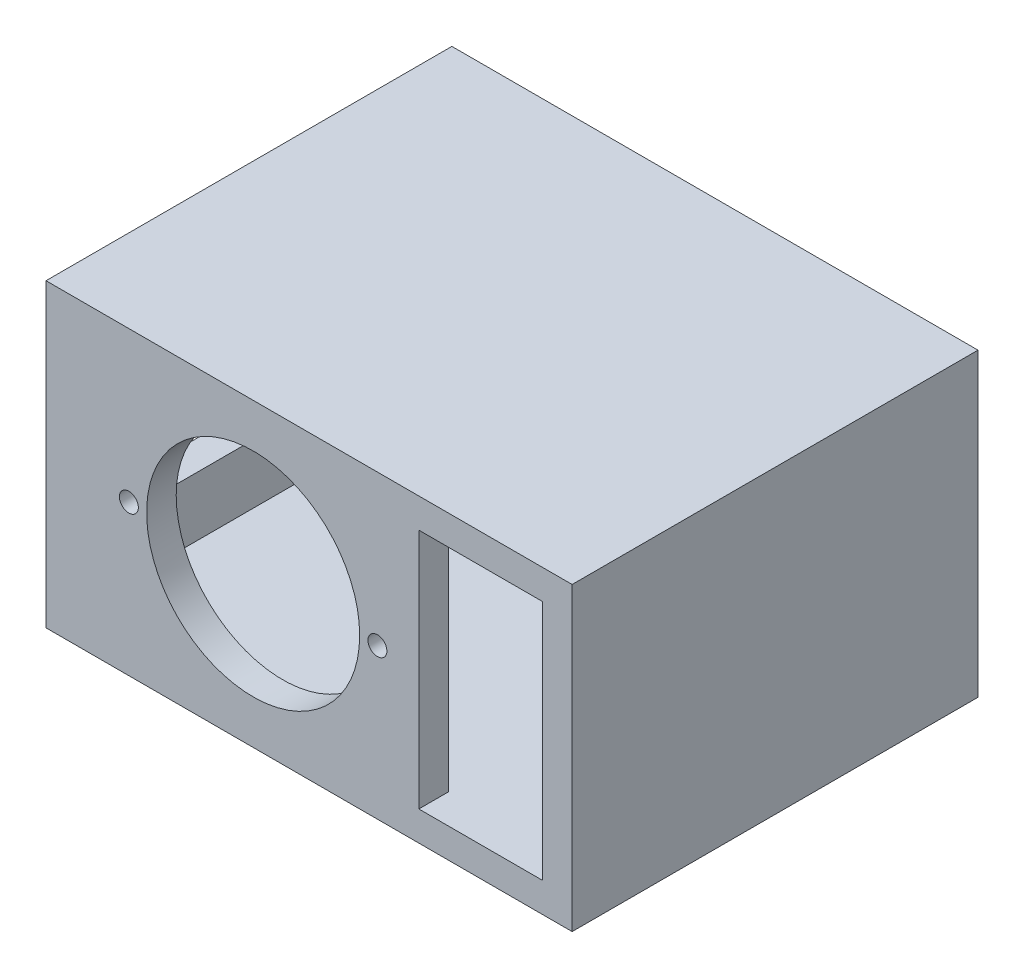
ISO-10303-21;
HEADER;
FILE_DESCRIPTION(('STEP AP214'),'2;1');
FILE_NAME('part.step','',(''),(''),'','','');
FILE_SCHEMA(('AUTOMOTIVE_DESIGN { 1 0 10303 214 1 1 1 1 }'));
ENDSEC;
DATA;
#1=APPLICATION_CONTEXT('core data for automotive mechanical design processes');
#2=APPLICATION_PROTOCOL_DEFINITION('international standard','automotive_design',2000,#1);
#3=PRODUCT_CONTEXT('',#1,'mechanical');
#4=PRODUCT('Part','Part','',(#3));
#5=PRODUCT_RELATED_PRODUCT_CATEGORY('part','',(#4));
#6=PRODUCT_DEFINITION_FORMATION('','',#4);
#7=PRODUCT_DEFINITION_CONTEXT('part definition',#1,'design');
#8=PRODUCT_DEFINITION('design','',#6,#7);
#9=PRODUCT_DEFINITION_SHAPE('','',#8);
#10=(LENGTH_UNIT() NAMED_UNIT(*) SI_UNIT(.MILLI.,.METRE.));
#11=(NAMED_UNIT(*) PLANE_ANGLE_UNIT() SI_UNIT($,.RADIAN.));
#12=(NAMED_UNIT(*) SI_UNIT($,.STERADIAN.) SOLID_ANGLE_UNIT());
#13=UNCERTAINTY_MEASURE_WITH_UNIT(LENGTH_MEASURE(1.E-05),#10,'distance_accuracy_value','');
#14=(GEOMETRIC_REPRESENTATION_CONTEXT(3) GLOBAL_UNCERTAINTY_ASSIGNED_CONTEXT((#13)) GLOBAL_UNIT_ASSIGNED_CONTEXT((#10,
#11,#12)) REPRESENTATION_CONTEXT('',''));
#15=CARTESIAN_POINT('',(0.,0.,0.));
#16=DIRECTION('',(0.,0.,1.));
#17=DIRECTION('',(1.,0.,0.));
#18=AXIS2_PLACEMENT_3D('',#15,#16,#17);
#19=CARTESIAN_POINT('',(5.,0.,68.58));
#20=DIRECTION('',(1.,0.,0.));
#21=DIRECTION('',(0.,0.,-1.));
#22=AXIS2_PLACEMENT_3D('',#19,#20,#21);
#23=PLANE('',#22);
#24=DIRECTION('',(0.,1.,0.));
#25=VECTOR('',#24,1.);
#26=CARTESIAN_POINT('',(5.,0.,15.));
#27=LINE('',#26,#25);
#28=CARTESIAN_POINT('',(5.,15.,15.));
#29=VERTEX_POINT('',#28);
#30=CARTESIAN_POINT('',(5.,35.8,15.));
#31=VERTEX_POINT('',#30);
#32=EDGE_CURVE('E179',#29,#31,#27,.T.);
#33=ORIENTED_EDGE('',*,*,#32,.F.);
#34=DIRECTION('',(0.,0.,-1.));
#35=VECTOR('',#34,1.);
#36=CARTESIAN_POINT('',(5.,15.,68.58));
#37=LINE('',#36,#35);
#38=CARTESIAN_POINT('',(5.,15.,53.58));
#39=VERTEX_POINT('',#38);
#40=EDGE_CURVE('E172',#39,#29,#37,.T.);
#41=ORIENTED_EDGE('',*,*,#40,.F.);
#42=DIRECTION('',(0.,-1.,0.));
#43=VECTOR('',#42,1.);
#44=CARTESIAN_POINT('',(5.,0.,53.58));
#45=LINE('',#44,#43);
#46=CARTESIAN_POINT('',(5.,35.8,53.58));
#47=VERTEX_POINT('',#46);
#48=EDGE_CURVE('E152',#47,#39,#45,.T.);
#49=ORIENTED_EDGE('',*,*,#48,.F.);
#50=DIRECTION('',(0.,0.,1.));
#51=VECTOR('',#50,1.);
#52=CARTESIAN_POINT('',(5.,35.8,68.58));
#53=LINE('',#52,#51);
#54=EDGE_CURVE('E177',#31,#47,#53,.T.);
#55=ORIENTED_EDGE('',*,*,#54,.F.);
#56=EDGE_LOOP('',(#33,#41,#49,#55));
#57=FACE_BOUND('',#56,.T.);
#58=DIRECTION('',(0.,-1.,0.));
#59=VECTOR('',#58,1.);
#60=CARTESIAN_POINT('',(5.,50.8,5.));
#61=LINE('',#60,#59);
#62=CARTESIAN_POINT('',(5.,45.8,5.));
#63=VERTEX_POINT('',#62);
#64=CARTESIAN_POINT('',(5.,5.,5.));
#65=VERTEX_POINT('',#64);
#66=EDGE_CURVE('E277',#63,#65,#61,.T.);
#67=ORIENTED_EDGE('',*,*,#66,.F.);
#68=DIRECTION('',(0.,0.,-1.));
#69=VECTOR('',#68,1.);
#70=CARTESIAN_POINT('',(5.,45.8,68.58));
#71=LINE('',#70,#69);
#72=CARTESIAN_POINT('',(5.,45.8,63.58));
#73=VERTEX_POINT('',#72);
#74=EDGE_CURVE('E296',#73,#63,#71,.T.);
#75=ORIENTED_EDGE('',*,*,#74,.F.);
#76=DIRECTION('',(0.,-1.,0.));
#77=VECTOR('',#76,1.);
#78=CARTESIAN_POINT('',(5.,50.8,63.58));
#79=LINE('',#78,#77);
#80=CARTESIAN_POINT('',(5.,5.,63.58));
#81=VERTEX_POINT('',#80);
#82=EDGE_CURVE('E281',#73,#81,#79,.T.);
#83=ORIENTED_EDGE('',*,*,#82,.T.);
#84=DIRECTION('',(0.,0.,-1.));
#85=VECTOR('',#84,1.);
#86=CARTESIAN_POINT('',(5.,5.,68.58));
#87=LINE('',#86,#85);
#88=EDGE_CURVE('E290',#81,#65,#87,.T.);
#89=ORIENTED_EDGE('',*,*,#88,.T.);
#90=EDGE_LOOP('',(#67,#75,#83,#89));
#91=FACE_BOUND('',#90,.T.);
#92=ADVANCED_FACE('F32',(#57,#91),#23,.T.);
#93=CARTESIAN_POINT('',(0.,5.,68.58));
#94=DIRECTION('',(0.,1.,0.));
#95=DIRECTION('',(0.,0.,1.));
#96=AXIS2_PLACEMENT_3D('',#93,#94,#95);
#97=PLANE('',#96);
#98=DIRECTION('',(1.,0.,0.));
#99=VECTOR('',#98,1.);
#100=CARTESIAN_POINT('',(0.,5.,63.58));
#101=LINE('',#100,#99);
#102=CARTESIAN_POINT('',(63.,5.,63.58));
#103=VERTEX_POINT('',#102);
#104=EDGE_CURVE('E41',#81,#103,#101,.T.);
#105=ORIENTED_EDGE('',*,*,#104,.T.);
#106=DIRECTION('',(0.,0.,1.));
#107=VECTOR('',#106,1.);
#108=CARTESIAN_POINT('',(63.,5.,0.));
#109=LINE('',#108,#107);
#110=CARTESIAN_POINT('',(63.,5.,68.58));
#111=VERTEX_POINT('',#110);
#112=EDGE_CURVE('E195',#103,#111,#109,.T.);
#113=ORIENTED_EDGE('',*,*,#112,.T.);
#114=DIRECTION('',(1.,0.,0.));
#115=VECTOR('',#114,1.);
#116=CARTESIAN_POINT('',(63.,5.,68.58));
#117=LINE('',#116,#115);
#118=CARTESIAN_POINT('',(83.9,5.,68.58));
#119=VERTEX_POINT('',#118);
#120=EDGE_CURVE('E197',#111,#119,#117,.T.);
#121=ORIENTED_EDGE('',*,*,#120,.T.);
#122=DIRECTION('',(0.,0.,-1.));
#123=VECTOR('',#122,1.);
#124=CARTESIAN_POINT('',(83.9,5.,68.58));
#125=LINE('',#124,#123);
#126=CARTESIAN_POINT('',(83.9,5.,0.));
#127=VERTEX_POINT('',#126);
#128=EDGE_CURVE('E288',#119,#127,#125,.T.);
#129=ORIENTED_EDGE('',*,*,#128,.T.);
#130=DIRECTION('',(1.,0.,0.));
#131=VECTOR('',#130,1.);
#132=CARTESIAN_POINT('',(63.,5.,0.));
#133=LINE('',#132,#131);
#134=CARTESIAN_POINT('',(63.,5.,0.));
#135=VERTEX_POINT('',#134);
#136=EDGE_CURVE('E185',#135,#127,#133,.T.);
#137=ORIENTED_EDGE('',*,*,#136,.F.);
#138=CARTESIAN_POINT('',(63.,5.,5.));
#139=VERTEX_POINT('',#138);
#140=EDGE_CURVE('E209',#135,#139,#109,.T.);
#141=ORIENTED_EDGE('',*,*,#140,.T.);
#142=DIRECTION('',(1.,0.,0.));
#143=VECTOR('',#142,1.);
#144=CARTESIAN_POINT('',(0.,5.,5.));
#145=LINE('',#144,#143);
#146=EDGE_CURVE('E293',#65,#139,#145,.T.);
#147=ORIENTED_EDGE('',*,*,#146,.F.);
#148=ORIENTED_EDGE('',*,*,#88,.F.);
#149=EDGE_LOOP('',(#105,#113,#121,#129,#137,#141,#147,#148));
#150=FACE_BOUND('',#149,.T.);
#151=ADVANCED_FACE('F307',(#150),#97,.T.);
#152=CARTESIAN_POINT('',(83.9,0.,68.58));
#153=DIRECTION('',(-1.,0.,0.));
#154=DIRECTION('',(0.,0.,1.));
#155=AXIS2_PLACEMENT_3D('',#152,#153,#154);
#156=PLANE('',#155);
#157=DIRECTION('',(0.,0.,-1.));
#158=VECTOR('',#157,1.);
#159=CARTESIAN_POINT('',(83.9,45.8,68.58));
#160=LINE('',#159,#158);
#161=CARTESIAN_POINT('',(83.9,45.8,68.58));
#162=VERTEX_POINT('',#161);
#163=CARTESIAN_POINT('',(83.9,45.8,0.));
#164=VERTEX_POINT('',#163);
#165=EDGE_CURVE('E284',#162,#164,#160,.T.);
#166=ORIENTED_EDGE('',*,*,#165,.T.);
#167=DIRECTION('',(0.,1.,0.));
#168=VECTOR('',#167,1.);
#169=CARTESIAN_POINT('',(83.9,45.8,0.));
#170=LINE('',#169,#168);
#171=EDGE_CURVE('E189',#127,#164,#170,.T.);
#172=ORIENTED_EDGE('',*,*,#171,.F.);
#173=ORIENTED_EDGE('',*,*,#128,.F.);
#174=DIRECTION('',(0.,1.,0.));
#175=VECTOR('',#174,1.);
#176=CARTESIAN_POINT('',(83.9,45.8,68.58));
#177=LINE('',#176,#175);
#178=EDGE_CURVE('E200',#119,#162,#177,.T.);
#179=ORIENTED_EDGE('',*,*,#178,.T.);
#180=EDGE_LOOP('',(#166,#172,#173,#179));
#181=FACE_BOUND('',#180,.T.);
#182=ADVANCED_FACE('F333',(#181),#156,.T.);
#183=CARTESIAN_POINT('',(0.,45.8,68.58));
#184=DIRECTION('',(0.,-1.,0.));
#185=DIRECTION('',(0.,0.,-1.));
#186=AXIS2_PLACEMENT_3D('',#183,#184,#185);
#187=PLANE('',#186);
#188=DIRECTION('',(-1.,0.,0.));
#189=VECTOR('',#188,1.);
#190=CARTESIAN_POINT('',(0.,45.8,5.));
#191=LINE('',#190,#189);
#192=CARTESIAN_POINT('',(63.,45.8,5.));
#193=VERTEX_POINT('',#192);
#194=EDGE_CURVE('E286',#193,#63,#191,.T.);
#195=ORIENTED_EDGE('',*,*,#194,.F.);
#196=DIRECTION('',(0.,0.,1.));
#197=VECTOR('',#196,1.);
#198=CARTESIAN_POINT('',(63.,45.8,0.));
#199=LINE('',#198,#197);
#200=CARTESIAN_POINT('',(63.,45.8,0.));
#201=VERTEX_POINT('',#200);
#202=EDGE_CURVE('E205',#201,#193,#199,.T.);
#203=ORIENTED_EDGE('',*,*,#202,.F.);
#204=DIRECTION('',(-1.,0.,0.));
#205=VECTOR('',#204,1.);
#206=CARTESIAN_POINT('',(63.,45.8,0.));
#207=LINE('',#206,#205);
#208=EDGE_CURVE('E192',#164,#201,#207,.T.);
#209=ORIENTED_EDGE('',*,*,#208,.F.);
#210=ORIENTED_EDGE('',*,*,#165,.F.);
#211=DIRECTION('',(-1.,0.,0.));
#212=VECTOR('',#211,1.);
#213=CARTESIAN_POINT('',(63.,45.8,68.58));
#214=LINE('',#213,#212);
#215=CARTESIAN_POINT('',(63.,45.8,68.58));
#216=VERTEX_POINT('',#215);
#217=EDGE_CURVE('E186',#162,#216,#214,.T.);
#218=ORIENTED_EDGE('',*,*,#217,.T.);
#219=CARTESIAN_POINT('',(63.,45.8,63.58));
#220=VERTEX_POINT('',#219);
#221=EDGE_CURVE('E208',#220,#216,#199,.T.);
#222=ORIENTED_EDGE('',*,*,#221,.F.);
#223=DIRECTION('',(-1.,0.,0.));
#224=VECTOR('',#223,1.);
#225=CARTESIAN_POINT('',(0.,45.8,63.58));
#226=LINE('',#225,#224);
#227=EDGE_CURVE('E11',#220,#73,#226,.T.);
#228=ORIENTED_EDGE('',*,*,#227,.T.);
#229=ORIENTED_EDGE('',*,*,#74,.T.);
#230=EDGE_LOOP('',(#195,#203,#209,#210,#218,#222,#228,#229));
#231=FACE_BOUND('',#230,.T.);
#232=ADVANCED_FACE('F315',(#231),#187,.T.);
#233=CARTESIAN_POINT('',(0.,50.8,63.58));
#234=DIRECTION('',(0.,0.,-1.));
#235=DIRECTION('',(-1.,0.,0.));
#236=AXIS2_PLACEMENT_3D('',#233,#234,#235);
#237=PLANE('',#236);
#238=DIRECTION('',(0.,1.,0.));
#239=VECTOR('',#238,1.);
#240=CARTESIAN_POINT('',(63.,50.8,63.58));
#241=LINE('',#240,#239);
#242=EDGE_CURVE('E213',#103,#220,#241,.T.);
#243=ORIENTED_EDGE('',*,*,#242,.F.);
#244=ORIENTED_EDGE('',*,*,#104,.F.);
#245=ORIENTED_EDGE('',*,*,#82,.F.);
#246=ORIENTED_EDGE('',*,*,#227,.F.);
#247=EDGE_LOOP('',(#243,#244,#245,#246));
#248=FACE_BOUND('',#247,.T.);
#249=CARTESIAN_POINT('',(56.,25.4,63.58));
#250=DIRECTION('',(0.,0.,-1.));
#251=DIRECTION('',(-1.,0.,0.));
#252=AXIS2_PLACEMENT_3D('',#249,#250,#251);
#253=CIRCLE('',#252,1.6);
#254=CARTESIAN_POINT('',(54.4,25.4,63.58));
#255=VERTEX_POINT('',#254);
#256=EDGE_CURVE('E224',#255,#255,#253,.T.);
#257=ORIENTED_EDGE('',*,*,#256,.F.);
#258=EDGE_LOOP('',(#257));
#259=FACE_BOUND('',#258,.T.);
#260=CARTESIAN_POINT('',(14.,25.4,63.58));
#261=DIRECTION('',(0.,0.,-1.));
#262=DIRECTION('',(-1.,0.,0.));
#263=AXIS2_PLACEMENT_3D('',#260,#261,#262);
#264=CIRCLE('',#263,1.6);
#265=CARTESIAN_POINT('',(12.4,25.4,63.58));
#266=VERTEX_POINT('',#265);
#267=EDGE_CURVE('E236',#266,#266,#264,.T.);
#268=ORIENTED_EDGE('',*,*,#267,.F.);
#269=EDGE_LOOP('',(#268));
#270=FACE_BOUND('',#269,.T.);
#271=CARTESIAN_POINT('',(35.,25.4,63.58));
#272=DIRECTION('',(0.,0.,-1.));
#273=DIRECTION('',(-1.,0.,0.));
#274=AXIS2_PLACEMENT_3D('',#271,#272,#273);
#275=CIRCLE('',#274,18.);
#276=CARTESIAN_POINT('',(17.,25.4,63.58));
#277=VERTEX_POINT('',#276);
#278=EDGE_CURVE('E245',#277,#277,#275,.T.);
#279=ORIENTED_EDGE('',*,*,#278,.F.);
#280=EDGE_LOOP('',(#279));
#281=FACE_BOUND('',#280,.T.);
#282=ADVANCED_FACE('F321',(#248,#259,#270,#281),#237,.T.);
#283=CARTESIAN_POINT('',(0.,50.8,5.));
#284=DIRECTION('',(0.,0.,-1.));
#285=DIRECTION('',(-1.,0.,0.));
#286=AXIS2_PLACEMENT_3D('',#283,#284,#285);
#287=PLANE('',#286);
#288=CARTESIAN_POINT('',(56.,25.4,5.));
#289=DIRECTION('',(0.,0.,-1.));
#290=DIRECTION('',(-1.,0.,0.));
#291=AXIS2_PLACEMENT_3D('',#288,#289,#290);
#292=CIRCLE('',#291,1.6);
#293=CARTESIAN_POINT('',(54.4,25.4,5.));
#294=VERTEX_POINT('',#293);
#295=EDGE_CURVE('E219',#294,#294,#292,.T.);
#296=ORIENTED_EDGE('',*,*,#295,.T.);
#297=EDGE_LOOP('',(#296));
#298=FACE_BOUND('',#297,.T.);
#299=CARTESIAN_POINT('',(14.,25.4,5.));
#300=DIRECTION('',(0.,0.,-1.));
#301=DIRECTION('',(-1.,0.,0.));
#302=AXIS2_PLACEMENT_3D('',#299,#300,#301);
#303=CIRCLE('',#302,1.6);
#304=CARTESIAN_POINT('',(12.4,25.4,5.));
#305=VERTEX_POINT('',#304);
#306=EDGE_CURVE('E231',#305,#305,#303,.T.);
#307=ORIENTED_EDGE('',*,*,#306,.T.);
#308=EDGE_LOOP('',(#307));
#309=FACE_BOUND('',#308,.T.);
#310=CARTESIAN_POINT('',(35.,25.4,5.));
#311=DIRECTION('',(0.,0.,-1.));
#312=DIRECTION('',(-1.,0.,0.));
#313=AXIS2_PLACEMENT_3D('',#310,#311,#312);
#314=CIRCLE('',#313,18.);
#315=CARTESIAN_POINT('',(17.,25.4,5.));
#316=VERTEX_POINT('',#315);
#317=EDGE_CURVE('E36',#316,#316,#314,.T.);
#318=ORIENTED_EDGE('',*,*,#317,.T.);
#319=EDGE_LOOP('',(#318));
#320=FACE_BOUND('',#319,.T.);
#321=ORIENTED_EDGE('',*,*,#146,.T.);
#322=DIRECTION('',(0.,1.,0.));
#323=VECTOR('',#322,1.);
#324=CARTESIAN_POINT('',(63.,50.8,5.));
#325=LINE('',#324,#323);
#326=EDGE_CURVE('E207',#139,#193,#325,.T.);
#327=ORIENTED_EDGE('',*,*,#326,.T.);
#328=ORIENTED_EDGE('',*,*,#194,.T.);
#329=ORIENTED_EDGE('',*,*,#66,.T.);
#330=EDGE_LOOP('',(#321,#327,#328,#329));
#331=FACE_BOUND('',#330,.T.);
#332=ADVANCED_FACE('F34',(#298,#309,#320,#331),#287,.F.);
#333=CARTESIAN_POINT('',(35.,25.4,0.));
#334=DIRECTION('',(0.,0.,1.));
#335=DIRECTION('',(1.,0.,0.));
#336=AXIS2_PLACEMENT_3D('',#333,#334,#335);
#337=CYLINDRICAL_SURFACE('',#336,18.);
#338=CARTESIAN_POINT('',(35.,25.4,0.));
#339=DIRECTION('',(0.,0.,1.));
#340=DIRECTION('',(1.,0.,0.));
#341=AXIS2_PLACEMENT_3D('',#338,#339,#340);
#342=CIRCLE('',#341,18.);
#343=CARTESIAN_POINT('',(53.,25.4,0.));
#344=VERTEX_POINT('',#343);
#345=EDGE_CURVE('E240',#344,#344,#342,.T.);
#346=ORIENTED_EDGE('',*,*,#345,.F.);
#347=EDGE_LOOP('',(#346));
#348=FACE_BOUND('',#347,.T.);
#349=ORIENTED_EDGE('',*,*,#317,.F.);
#350=EDGE_LOOP('',(#349));
#351=FACE_BOUND('',#350,.T.);
#352=ADVANCED_FACE('F389',(#348,#351),#337,.F.);
#353=ORIENTED_EDGE('',*,*,#278,.T.);
#354=EDGE_LOOP('',(#353));
#355=FACE_BOUND('',#354,.T.);
#356=CARTESIAN_POINT('',(35.,25.4,68.58));
#357=DIRECTION('',(0.,0.,1.));
#358=DIRECTION('',(1.,0.,0.));
#359=AXIS2_PLACEMENT_3D('',#356,#357,#358);
#360=CIRCLE('',#359,18.);
#361=CARTESIAN_POINT('',(53.,25.4,68.58));
#362=VERTEX_POINT('',#361);
#363=EDGE_CURVE('E239',#362,#362,#360,.T.);
#364=ORIENTED_EDGE('',*,*,#363,.T.);
#365=EDGE_LOOP('',(#364));
#366=FACE_BOUND('',#365,.T.);
#367=ADVANCED_FACE('F394',(#355,#366),#337,.F.);
#368=CARTESIAN_POINT('',(0.,0.,68.58));
#369=DIRECTION('',(1.,0.,0.));
#370=DIRECTION('',(0.,0.,-1.));
#371=AXIS2_PLACEMENT_3D('',#368,#369,#370);
#372=PLANE('',#371);
#373=DIRECTION('',(0.,0.,1.));
#374=VECTOR('',#373,1.);
#375=CARTESIAN_POINT('',(0.,15.,15.));
#376=LINE('',#375,#374);
#377=CARTESIAN_POINT('',(0.,15.,15.));
#378=VERTEX_POINT('',#377);
#379=CARTESIAN_POINT('',(0.,15.,53.58));
#380=VERTEX_POINT('',#379);
#381=EDGE_CURVE('E158',#378,#380,#376,.T.);
#382=ORIENTED_EDGE('',*,*,#381,.F.);
#383=DIRECTION('',(0.,-1.,0.));
#384=VECTOR('',#383,1.);
#385=CARTESIAN_POINT('',(0.,35.8,15.));
#386=LINE('',#385,#384);
#387=CARTESIAN_POINT('',(0.,35.8,15.));
#388=VERTEX_POINT('',#387);
#389=EDGE_CURVE('E57',#388,#378,#386,.T.);
#390=ORIENTED_EDGE('',*,*,#389,.F.);
#391=DIRECTION('',(0.,0.,-1.));
#392=VECTOR('',#391,1.);
#393=CARTESIAN_POINT('',(0.,35.8,15.));
#394=LINE('',#393,#392);
#395=CARTESIAN_POINT('',(0.,35.8,53.58));
#396=VERTEX_POINT('',#395);
#397=EDGE_CURVE('E165',#396,#388,#394,.T.);
#398=ORIENTED_EDGE('',*,*,#397,.F.);
#399=DIRECTION('',(0.,1.,0.));
#400=VECTOR('',#399,1.);
#401=CARTESIAN_POINT('',(0.,35.8,53.58));
#402=LINE('',#401,#400);
#403=EDGE_CURVE('E149',#380,#396,#402,.T.);
#404=ORIENTED_EDGE('',*,*,#403,.F.);
#405=EDGE_LOOP('',(#382,#390,#398,#404));
#406=FACE_BOUND('',#405,.T.);
#407=DIRECTION('',(0.,-1.,0.));
#408=VECTOR('',#407,1.);
#409=CARTESIAN_POINT('',(0.,0.,0.));
#410=LINE('',#409,#408);
#411=CARTESIAN_POINT('',(0.,50.8,0.));
#412=VERTEX_POINT('',#411);
#413=CARTESIAN_POINT('',(0.,0.,0.));
#414=VERTEX_POINT('',#413);
#415=EDGE_CURVE('E248',#412,#414,#410,.T.);
#416=ORIENTED_EDGE('',*,*,#415,.T.);
#417=DIRECTION('',(0.,0.,-1.));
#418=VECTOR('',#417,1.);
#419=CARTESIAN_POINT('',(0.,0.,68.58));
#420=LINE('',#419,#418);
#421=CARTESIAN_POINT('',(0.,0.,68.58));
#422=VERTEX_POINT('',#421);
#423=EDGE_CURVE('E275',#422,#414,#420,.T.);
#424=ORIENTED_EDGE('',*,*,#423,.F.);
#425=DIRECTION('',(0.,-1.,0.));
#426=VECTOR('',#425,1.);
#427=CARTESIAN_POINT('',(0.,0.,68.58));
#428=LINE('',#427,#426);
#429=CARTESIAN_POINT('',(0.,50.8,68.58));
#430=VERTEX_POINT('',#429);
#431=EDGE_CURVE('E249',#430,#422,#428,.T.);
#432=ORIENTED_EDGE('',*,*,#431,.F.);
#433=DIRECTION('',(0.,0.,-1.));
#434=VECTOR('',#433,1.);
#435=CARTESIAN_POINT('',(0.,50.8,68.58));
#436=LINE('',#435,#434);
#437=EDGE_CURVE('E259',#430,#412,#436,.T.);
#438=ORIENTED_EDGE('',*,*,#437,.T.);
#439=EDGE_LOOP('',(#416,#424,#432,#438));
#440=FACE_BOUND('',#439,.T.);
#441=ADVANCED_FACE('F162',(#406,#440),#372,.F.);
#442=CARTESIAN_POINT('',(0.,0.,68.58));
#443=DIRECTION('',(0.,1.,0.));
#444=DIRECTION('',(0.,0.,1.));
#445=AXIS2_PLACEMENT_3D('',#442,#443,#444);
#446=PLANE('',#445);
#447=DIRECTION('',(1.,0.,0.));
#448=VECTOR('',#447,1.);
#449=CARTESIAN_POINT('',(0.,0.,0.));
#450=LINE('',#449,#448);
#451=CARTESIAN_POINT('',(88.9,0.,0.));
#452=VERTEX_POINT('',#451);
#453=EDGE_CURVE('E262',#414,#452,#450,.T.);
#454=ORIENTED_EDGE('',*,*,#453,.T.);
#455=DIRECTION('',(0.,0.,-1.));
#456=VECTOR('',#455,1.);
#457=CARTESIAN_POINT('',(88.9,0.,68.58));
#458=LINE('',#457,#456);
#459=CARTESIAN_POINT('',(88.9,0.,68.58));
#460=VERTEX_POINT('',#459);
#461=EDGE_CURVE('E272',#460,#452,#458,.T.);
#462=ORIENTED_EDGE('',*,*,#461,.F.);
#463=DIRECTION('',(1.,0.,0.));
#464=VECTOR('',#463,1.);
#465=CARTESIAN_POINT('',(0.,0.,68.58));
#466=LINE('',#465,#464);
#467=EDGE_CURVE('E252',#422,#460,#466,.T.);
#468=ORIENTED_EDGE('',*,*,#467,.F.);
#469=ORIENTED_EDGE('',*,*,#423,.T.);
#470=EDGE_LOOP('',(#454,#462,#468,#469));
#471=FACE_BOUND('',#470,.T.);
#472=ADVANCED_FACE('F362',(#471),#446,.F.);
#473=CARTESIAN_POINT('',(88.9,0.,68.58));
#474=DIRECTION('',(-1.,0.,0.));
#475=DIRECTION('',(0.,0.,1.));
#476=AXIS2_PLACEMENT_3D('',#473,#474,#475);
#477=PLANE('',#476);
#478=DIRECTION('',(0.,1.,0.));
#479=VECTOR('',#478,1.);
#480=CARTESIAN_POINT('',(88.9,0.,0.));
#481=LINE('',#480,#479);
#482=CARTESIAN_POINT('',(88.9,50.8,0.));
#483=VERTEX_POINT('',#482);
#484=EDGE_CURVE('E264',#452,#483,#481,.T.);
#485=ORIENTED_EDGE('',*,*,#484,.T.);
#486=DIRECTION('',(0.,0.,-1.));
#487=VECTOR('',#486,1.);
#488=CARTESIAN_POINT('',(88.9,50.8,68.58));
#489=LINE('',#488,#487);
#490=CARTESIAN_POINT('',(88.9,50.8,68.58));
#491=VERTEX_POINT('',#490);
#492=EDGE_CURVE('E269',#491,#483,#489,.T.);
#493=ORIENTED_EDGE('',*,*,#492,.F.);
#494=DIRECTION('',(0.,1.,0.));
#495=VECTOR('',#494,1.);
#496=CARTESIAN_POINT('',(88.9,0.,68.58));
#497=LINE('',#496,#495);
#498=EDGE_CURVE('E255',#460,#491,#497,.T.);
#499=ORIENTED_EDGE('',*,*,#498,.F.);
#500=ORIENTED_EDGE('',*,*,#461,.T.);
#501=EDGE_LOOP('',(#485,#493,#499,#500));
#502=FACE_BOUND('',#501,.T.);
#503=ADVANCED_FACE('F359',(#502),#477,.F.);
#504=CARTESIAN_POINT('',(0.,50.8,68.58));
#505=DIRECTION('',(0.,-1.,0.));
#506=DIRECTION('',(0.,0.,-1.));
#507=AXIS2_PLACEMENT_3D('',#504,#505,#506);
#508=PLANE('',#507);
#509=DIRECTION('',(-1.,0.,0.));
#510=VECTOR('',#509,1.);
#511=CARTESIAN_POINT('',(0.,50.8,0.));
#512=LINE('',#511,#510);
#513=EDGE_CURVE('E253',#483,#412,#512,.T.);
#514=ORIENTED_EDGE('',*,*,#513,.T.);
#515=ORIENTED_EDGE('',*,*,#437,.F.);
#516=DIRECTION('',(-1.,0.,0.));
#517=VECTOR('',#516,1.);
#518=CARTESIAN_POINT('',(0.,50.8,68.58));
#519=LINE('',#518,#517);
#520=EDGE_CURVE('E257',#491,#430,#519,.T.);
#521=ORIENTED_EDGE('',*,*,#520,.F.);
#522=ORIENTED_EDGE('',*,*,#492,.T.);
#523=EDGE_LOOP('',(#514,#515,#521,#522));
#524=FACE_BOUND('',#523,.T.);
#525=ADVANCED_FACE('F355',(#524),#508,.F.);
#526=CARTESIAN_POINT('',(0.,50.8,68.58));
#527=DIRECTION('',(0.,0.,-1.));
#528=DIRECTION('',(-1.,0.,0.));
#529=AXIS2_PLACEMENT_3D('',#526,#527,#528);
#530=PLANE('',#529);
#531=ORIENTED_EDGE('',*,*,#120,.F.);
#532=DIRECTION('',(0.,-1.,0.));
#533=VECTOR('',#532,1.);
#534=CARTESIAN_POINT('',(63.,45.8,68.58));
#535=LINE('',#534,#533);
#536=EDGE_CURVE('E181',#216,#111,#535,.T.);
#537=ORIENTED_EDGE('',*,*,#536,.F.);
#538=ORIENTED_EDGE('',*,*,#217,.F.);
#539=ORIENTED_EDGE('',*,*,#178,.F.);
#540=EDGE_LOOP('',(#531,#537,#538,#539));
#541=FACE_BOUND('',#540,.T.);
#542=CARTESIAN_POINT('',(56.,25.4,68.58));
#543=DIRECTION('',(0.,0.,1.));
#544=DIRECTION('',(1.,0.,0.));
#545=AXIS2_PLACEMENT_3D('',#542,#543,#544);
#546=CIRCLE('',#545,1.6);
#547=CARTESIAN_POINT('',(57.6,25.4,68.58));
#548=VERTEX_POINT('',#547);
#549=EDGE_CURVE('E215',#548,#548,#546,.T.);
#550=ORIENTED_EDGE('',*,*,#549,.F.);
#551=EDGE_LOOP('',(#550));
#552=FACE_BOUND('',#551,.T.);
#553=CARTESIAN_POINT('',(14.,25.4,68.58));
#554=DIRECTION('',(0.,0.,1.));
#555=DIRECTION('',(1.,0.,0.));
#556=AXIS2_PLACEMENT_3D('',#553,#554,#555);
#557=CIRCLE('',#556,1.6);
#558=CARTESIAN_POINT('',(15.6,25.4,68.58));
#559=VERTEX_POINT('',#558);
#560=EDGE_CURVE('E227',#559,#559,#557,.T.);
#561=ORIENTED_EDGE('',*,*,#560,.F.);
#562=EDGE_LOOP('',(#561));
#563=FACE_BOUND('',#562,.T.);
#564=ORIENTED_EDGE('',*,*,#363,.F.);
#565=EDGE_LOOP('',(#564));
#566=FACE_BOUND('',#565,.T.);
#567=ORIENTED_EDGE('',*,*,#431,.T.);
#568=ORIENTED_EDGE('',*,*,#467,.T.);
#569=ORIENTED_EDGE('',*,*,#498,.T.);
#570=ORIENTED_EDGE('',*,*,#520,.T.);
#571=EDGE_LOOP('',(#567,#568,#569,#570));
#572=FACE_BOUND('',#571,.T.);
#573=ADVANCED_FACE('F329',(#541,#552,#563,#566,#572),#530,.F.);
#574=CARTESIAN_POINT('',(0.,50.8,0.));
#575=DIRECTION('',(0.,0.,-1.));
#576=DIRECTION('',(-1.,0.,0.));
#577=AXIS2_PLACEMENT_3D('',#574,#575,#576);
#578=PLANE('',#577);
#579=DIRECTION('',(0.,-1.,0.));
#580=VECTOR('',#579,1.);
#581=CARTESIAN_POINT('',(63.,45.8,0.));
#582=LINE('',#581,#580);
#583=EDGE_CURVE('E182',#201,#135,#582,.T.);
#584=ORIENTED_EDGE('',*,*,#583,.T.);
#585=ORIENTED_EDGE('',*,*,#136,.T.);
#586=ORIENTED_EDGE('',*,*,#171,.T.);
#587=ORIENTED_EDGE('',*,*,#208,.T.);
#588=EDGE_LOOP('',(#584,#585,#586,#587));
#589=FACE_BOUND('',#588,.T.);
#590=CARTESIAN_POINT('',(56.,25.4,0.));
#591=DIRECTION('',(0.,0.,1.));
#592=DIRECTION('',(1.,0.,0.));
#593=AXIS2_PLACEMENT_3D('',#590,#591,#592);
#594=CIRCLE('',#593,1.6);
#595=CARTESIAN_POINT('',(57.6,25.4,0.));
#596=VERTEX_POINT('',#595);
#597=EDGE_CURVE('E216',#596,#596,#594,.T.);
#598=ORIENTED_EDGE('',*,*,#597,.T.);
#599=EDGE_LOOP('',(#598));
#600=FACE_BOUND('',#599,.T.);
#601=CARTESIAN_POINT('',(14.,25.4,0.));
#602=DIRECTION('',(0.,0.,1.));
#603=DIRECTION('',(1.,0.,0.));
#604=AXIS2_PLACEMENT_3D('',#601,#602,#603);
#605=CIRCLE('',#604,1.6);
#606=CARTESIAN_POINT('',(15.6,25.4,0.));
#607=VERTEX_POINT('',#606);
#608=EDGE_CURVE('E228',#607,#607,#605,.T.);
#609=ORIENTED_EDGE('',*,*,#608,.T.);
#610=EDGE_LOOP('',(#609));
#611=FACE_BOUND('',#610,.T.);
#612=ORIENTED_EDGE('',*,*,#345,.T.);
#613=EDGE_LOOP('',(#612));
#614=FACE_BOUND('',#613,.T.);
#615=ORIENTED_EDGE('',*,*,#415,.F.);
#616=ORIENTED_EDGE('',*,*,#513,.F.);
#617=ORIENTED_EDGE('',*,*,#484,.F.);
#618=ORIENTED_EDGE('',*,*,#453,.F.);
#619=EDGE_LOOP('',(#615,#616,#617,#618));
#620=FACE_BOUND('',#619,.T.);
#621=ADVANCED_FACE('F336',(#589,#600,#611,#614,#620),#578,.T.);
#622=CARTESIAN_POINT('',(14.,25.4,0.));
#623=DIRECTION('',(0.,0.,1.));
#624=DIRECTION('',(1.,0.,0.));
#625=AXIS2_PLACEMENT_3D('',#622,#623,#624);
#626=CYLINDRICAL_SURFACE('',#625,1.6);
#627=ORIENTED_EDGE('',*,*,#608,.F.);
#628=EDGE_LOOP('',(#627));
#629=FACE_BOUND('',#628,.T.);
#630=ORIENTED_EDGE('',*,*,#306,.F.);
#631=EDGE_LOOP('',(#630));
#632=FACE_BOUND('',#631,.T.);
#633=ADVANCED_FACE('F339',(#629,#632),#626,.F.);
#634=ORIENTED_EDGE('',*,*,#267,.T.);
#635=EDGE_LOOP('',(#634));
#636=FACE_BOUND('',#635,.T.);
#637=ORIENTED_EDGE('',*,*,#560,.T.);
#638=EDGE_LOOP('',(#637));
#639=FACE_BOUND('',#638,.T.);
#640=ADVANCED_FACE('F405',(#636,#639),#626,.F.);
#641=CARTESIAN_POINT('',(56.,25.4,0.));
#642=DIRECTION('',(0.,0.,1.));
#643=DIRECTION('',(1.,0.,0.));
#644=AXIS2_PLACEMENT_3D('',#641,#642,#643);
#645=CYLINDRICAL_SURFACE('',#644,1.6);
#646=ORIENTED_EDGE('',*,*,#597,.F.);
#647=EDGE_LOOP('',(#646));
#648=FACE_BOUND('',#647,.T.);
#649=ORIENTED_EDGE('',*,*,#295,.F.);
#650=EDGE_LOOP('',(#649));
#651=FACE_BOUND('',#650,.T.);
#652=ADVANCED_FACE('F411',(#648,#651),#645,.F.);
#653=ORIENTED_EDGE('',*,*,#256,.T.);
#654=EDGE_LOOP('',(#653));
#655=FACE_BOUND('',#654,.T.);
#656=ORIENTED_EDGE('',*,*,#549,.T.);
#657=EDGE_LOOP('',(#656));
#658=FACE_BOUND('',#657,.T.);
#659=ADVANCED_FACE('F414',(#655,#658),#645,.F.);
#660=CARTESIAN_POINT('',(63.,45.8,0.));
#661=DIRECTION('',(-1.,0.,0.));
#662=DIRECTION('',(0.,0.,1.));
#663=AXIS2_PLACEMENT_3D('',#660,#661,#662);
#664=PLANE('',#663);
#665=ORIENTED_EDGE('',*,*,#140,.F.);
#666=ORIENTED_EDGE('',*,*,#583,.F.);
#667=ORIENTED_EDGE('',*,*,#202,.T.);
#668=ORIENTED_EDGE('',*,*,#326,.F.);
#669=EDGE_LOOP('',(#665,#666,#667,#668));
#670=FACE_BOUND('',#669,.T.);
#671=ADVANCED_FACE('F313',(#670),#664,.F.);
#672=ORIENTED_EDGE('',*,*,#242,.T.);
#673=ORIENTED_EDGE('',*,*,#221,.T.);
#674=ORIENTED_EDGE('',*,*,#536,.T.);
#675=ORIENTED_EDGE('',*,*,#112,.F.);
#676=EDGE_LOOP('',(#672,#673,#674,#675));
#677=FACE_BOUND('',#676,.T.);
#678=ADVANCED_FACE('F324',(#677),#664,.F.);
#679=CARTESIAN_POINT('',(10.,35.8,15.));
#680=DIRECTION('',(0.,0.,-1.));
#681=DIRECTION('',(0.,1.,0.));
#682=AXIS2_PLACEMENT_3D('',#679,#680,#681);
#683=PLANE('',#682);
#684=ORIENTED_EDGE('',*,*,#32,.T.);
#685=DIRECTION('',(-1.,0.,0.));
#686=VECTOR('',#685,1.);
#687=CARTESIAN_POINT('',(10.,35.8,15.));
#688=LINE('',#687,#686);
#689=EDGE_CURVE('E170',#31,#388,#688,.T.);
#690=ORIENTED_EDGE('',*,*,#689,.T.);
#691=ORIENTED_EDGE('',*,*,#389,.T.);
#692=DIRECTION('',(-1.,0.,0.));
#693=VECTOR('',#692,1.);
#694=CARTESIAN_POINT('',(10.,15.,15.));
#695=LINE('',#694,#693);
#696=EDGE_CURVE('E155',#29,#378,#695,.T.);
#697=ORIENTED_EDGE('',*,*,#696,.F.);
#698=EDGE_LOOP('',(#684,#690,#691,#697));
#699=FACE_BOUND('',#698,.T.);
#700=ADVANCED_FACE('F530',(#699),#683,.F.);
#701=CARTESIAN_POINT('',(10.,35.8,15.));
#702=DIRECTION('',(0.,1.,0.));
#703=DIRECTION('',(0.,0.,1.));
#704=AXIS2_PLACEMENT_3D('',#701,#702,#703);
#705=PLANE('',#704);
#706=ORIENTED_EDGE('',*,*,#54,.T.);
#707=DIRECTION('',(-1.,0.,0.));
#708=VECTOR('',#707,1.);
#709=CARTESIAN_POINT('',(10.,35.8,53.58));
#710=LINE('',#709,#708);
#711=EDGE_CURVE('E154',#47,#396,#710,.T.);
#712=ORIENTED_EDGE('',*,*,#711,.T.);
#713=ORIENTED_EDGE('',*,*,#397,.T.);
#714=ORIENTED_EDGE('',*,*,#689,.F.);
#715=EDGE_LOOP('',(#706,#712,#713,#714));
#716=FACE_BOUND('',#715,.T.);
#717=ADVANCED_FACE('F547',(#716),#705,.F.);
#718=CARTESIAN_POINT('',(10.,35.8,53.58));
#719=DIRECTION('',(0.,0.,1.));
#720=DIRECTION('',(0.,-1.,0.));
#721=AXIS2_PLACEMENT_3D('',#718,#719,#720);
#722=PLANE('',#721);
#723=ORIENTED_EDGE('',*,*,#48,.T.);
#724=DIRECTION('',(-1.,0.,0.));
#725=VECTOR('',#724,1.);
#726=CARTESIAN_POINT('',(10.,15.,53.58));
#727=LINE('',#726,#725);
#728=EDGE_CURVE('E49',#39,#380,#727,.T.);
#729=ORIENTED_EDGE('',*,*,#728,.T.);
#730=ORIENTED_EDGE('',*,*,#403,.T.);
#731=ORIENTED_EDGE('',*,*,#711,.F.);
#732=EDGE_LOOP('',(#723,#729,#730,#731));
#733=FACE_BOUND('',#732,.T.);
#734=ADVANCED_FACE('F146',(#733),#722,.F.);
#735=CARTESIAN_POINT('',(10.,15.,15.));
#736=DIRECTION('',(0.,-1.,0.));
#737=DIRECTION('',(0.,0.,-1.));
#738=AXIS2_PLACEMENT_3D('',#735,#736,#737);
#739=PLANE('',#738);
#740=ORIENTED_EDGE('',*,*,#40,.T.);
#741=ORIENTED_EDGE('',*,*,#696,.T.);
#742=ORIENTED_EDGE('',*,*,#381,.T.);
#743=ORIENTED_EDGE('',*,*,#728,.F.);
#744=EDGE_LOOP('',(#740,#741,#742,#743));
#745=FACE_BOUND('',#744,.T.);
#746=ADVANCED_FACE('F159',(#745),#739,.F.);
#747=CLOSED_SHELL('',(#92,#151,#182,#232,#282,#332,#352,#367,#441,#472,#503,#525,#573,#621,#633,
#640,#652,#659,#671,#678,#700,#717,#734,#746));
#748=MANIFOLD_SOLID_BREP('B2',#747);
#749=ADVANCED_BREP_SHAPE_REPRESENTATION('',(#18,#748),#14);
#750=SHAPE_DEFINITION_REPRESENTATION(#9,#749);
ENDSEC;
END-ISO-10303-21;
